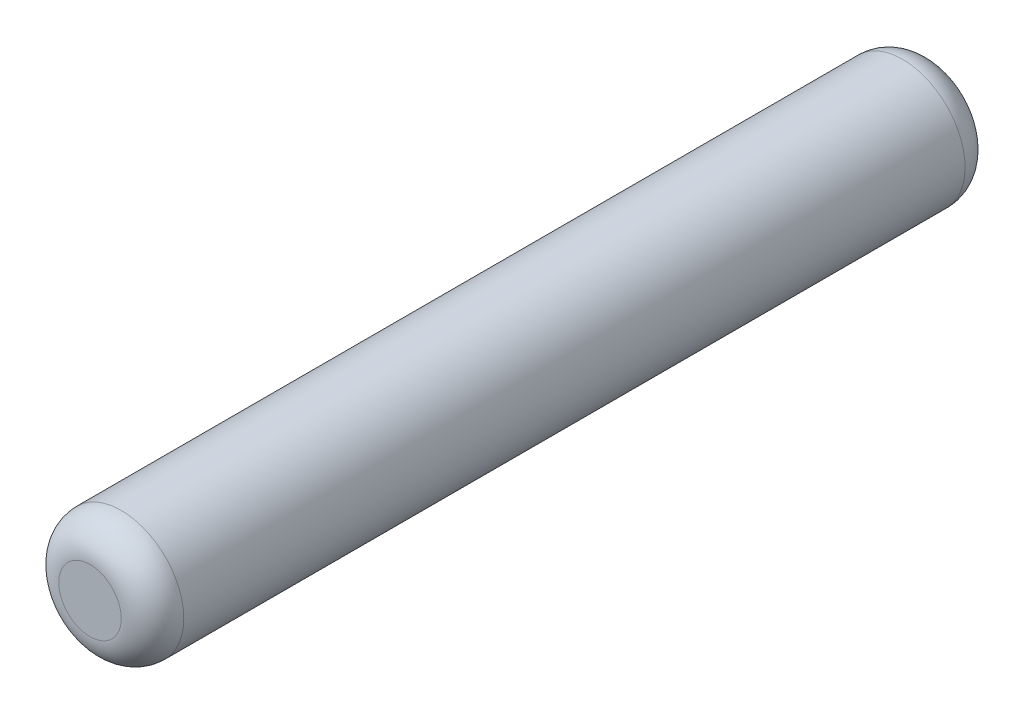
ISO-10303-21;
HEADER;
FILE_DESCRIPTION(('STEP AP214'),'2;1');
FILE_NAME('part.step','',(''),(''),'','','');
FILE_SCHEMA(('AUTOMOTIVE_DESIGN { 1 0 10303 214 1 1 1 1 }'));
ENDSEC;
DATA;
#1=APPLICATION_CONTEXT('core data for automotive mechanical design processes');
#2=APPLICATION_PROTOCOL_DEFINITION('international standard','automotive_design',2000,#1);
#3=PRODUCT_CONTEXT('',#1,'mechanical');
#4=PRODUCT('Part','Part','',(#3));
#5=PRODUCT_RELATED_PRODUCT_CATEGORY('part','',(#4));
#6=PRODUCT_DEFINITION_FORMATION('','',#4);
#7=PRODUCT_DEFINITION_CONTEXT('part definition',#1,'design');
#8=PRODUCT_DEFINITION('design','',#6,#7);
#9=PRODUCT_DEFINITION_SHAPE('','',#8);
#10=(LENGTH_UNIT() NAMED_UNIT(*) SI_UNIT(.MILLI.,.METRE.));
#11=(NAMED_UNIT(*) PLANE_ANGLE_UNIT() SI_UNIT($,.RADIAN.));
#12=(NAMED_UNIT(*) SI_UNIT($,.STERADIAN.) SOLID_ANGLE_UNIT());
#13=UNCERTAINTY_MEASURE_WITH_UNIT(LENGTH_MEASURE(1.E-05),#10,'distance_accuracy_value','');
#14=(GEOMETRIC_REPRESENTATION_CONTEXT(3) GLOBAL_UNCERTAINTY_ASSIGNED_CONTEXT((#13)) GLOBAL_UNIT_ASSIGNED_CONTEXT((#10,
#11,#12)) REPRESENTATION_CONTEXT('',''));
#15=CARTESIAN_POINT('',(0.,0.,0.));
#16=DIRECTION('',(0.,0.,1.));
#17=DIRECTION('',(1.,0.,0.));
#18=AXIS2_PLACEMENT_3D('',#15,#16,#17);
#19=CARTESIAN_POINT('',(0.,0.,27.));
#20=DIRECTION('',(0.,0.,-1.));
#21=DIRECTION('',(-1.,0.,0.));
#22=AXIS2_PLACEMENT_3D('',#19,#20,#21);
#23=CYLINDRICAL_SURFACE('',#22,2.);
#24=CARTESIAN_POINT('',(0.,0.,26.));
#25=DIRECTION('',(0.,0.,1.));
#26=DIRECTION('',(1.,0.,0.));
#27=AXIS2_PLACEMENT_3D('',#24,#25,#26);
#28=CIRCLE('',#27,2.);
#29=CARTESIAN_POINT('',(2.,0.,26.));
#30=VERTEX_POINT('',#29);
#31=EDGE_CURVE('E36',#30,#30,#28,.F.);
#32=ORIENTED_EDGE('',*,*,#31,.T.);
#33=EDGE_LOOP('',(#32));
#34=FACE_BOUND('',#33,.T.);
#35=CARTESIAN_POINT('',(0.,0.,1.));
#36=DIRECTION('',(0.,0.,1.));
#37=DIRECTION('',(1.,0.,0.));
#38=AXIS2_PLACEMENT_3D('',#35,#36,#37);
#39=CIRCLE('',#38,2.);
#40=CARTESIAN_POINT('',(2.,0.,1.));
#41=VERTEX_POINT('',#40);
#42=EDGE_CURVE('E40',#41,#41,#39,.T.);
#43=ORIENTED_EDGE('',*,*,#42,.T.);
#44=EDGE_LOOP('',(#43));
#45=FACE_BOUND('',#44,.T.);
#46=ADVANCED_FACE('F30',(#34,#45),#23,.T.);
#47=CARTESIAN_POINT('',(0.,0.,27.));
#48=DIRECTION('',(0.,0.,1.));
#49=DIRECTION('',(1.,0.,0.));
#50=AXIS2_PLACEMENT_3D('',#47,#48,#49);
#51=PLANE('',#50);
#52=CARTESIAN_POINT('',(0.,0.,27.));
#53=DIRECTION('',(0.,0.,1.));
#54=DIRECTION('',(1.,0.,0.));
#55=AXIS2_PLACEMENT_3D('',#52,#53,#54);
#56=CIRCLE('',#55,0.999999999999998);
#57=CARTESIAN_POINT('',(0.999999999999998,0.,27.));
#58=VERTEX_POINT('',#57);
#59=EDGE_CURVE('E44',#58,#58,#56,.T.);
#60=ORIENTED_EDGE('',*,*,#59,.T.);
#61=EDGE_LOOP('',(#60));
#62=FACE_BOUND('',#61,.T.);
#63=ADVANCED_FACE('F50',(#62),#51,.T.);
#64=CARTESIAN_POINT('',(0.,0.,0.));
#65=DIRECTION('',(0.,0.,1.));
#66=DIRECTION('',(1.,0.,0.));
#67=AXIS2_PLACEMENT_3D('',#64,#65,#66);
#68=PLANE('',#67);
#69=CARTESIAN_POINT('',(0.,0.,0.));
#70=DIRECTION('',(0.,0.,1.));
#71=DIRECTION('',(1.,0.,0.));
#72=AXIS2_PLACEMENT_3D('',#69,#70,#71);
#73=CIRCLE('',#72,0.999999999999998);
#74=CARTESIAN_POINT('',(0.999999999999998,0.,0.));
#75=VERTEX_POINT('',#74);
#76=EDGE_CURVE('E10',#75,#75,#73,.F.);
#77=ORIENTED_EDGE('',*,*,#76,.T.);
#78=EDGE_LOOP('',(#77));
#79=FACE_BOUND('',#78,.T.);
#80=ADVANCED_FACE('F55',(#79),#68,.F.);
#81=CARTESIAN_POINT('',(0.,0.,26.));
#82=DIRECTION('',(0.,0.,1.));
#83=DIRECTION('',(1.,0.,0.));
#84=AXIS2_PLACEMENT_3D('',#81,#82,#83);
#85=DEGENERATE_TOROIDAL_SURFACE('',#84,0.999999999999998,1.,.T.);
#86=ORIENTED_EDGE('',*,*,#31,.F.);
#87=EDGE_LOOP('',(#86));
#88=FACE_BOUND('',#87,.T.);
#89=ORIENTED_EDGE('',*,*,#59,.F.);
#90=EDGE_LOOP('',(#89));
#91=FACE_BOUND('',#90,.T.);
#92=ADVANCED_FACE('F52',(#88,#91),#85,.T.);
#93=CARTESIAN_POINT('',(0.,0.,1.));
#94=DIRECTION('',(0.,0.,1.));
#95=DIRECTION('',(1.,0.,0.));
#96=AXIS2_PLACEMENT_3D('',#93,#94,#95);
#97=DEGENERATE_TOROIDAL_SURFACE('',#96,0.999999999999998,1.,.T.);
#98=ORIENTED_EDGE('',*,*,#76,.F.);
#99=EDGE_LOOP('',(#98));
#100=FACE_BOUND('',#99,.T.);
#101=ORIENTED_EDGE('',*,*,#42,.F.);
#102=EDGE_LOOP('',(#101));
#103=FACE_BOUND('',#102,.T.);
#104=ADVANCED_FACE('F54',(#100,#103),#97,.T.);
#105=CLOSED_SHELL('',(#46,#63,#80,#92,#104));
#106=MANIFOLD_SOLID_BREP('B2',#105);
#107=ADVANCED_BREP_SHAPE_REPRESENTATION('',(#18,#106),#14);
#108=SHAPE_DEFINITION_REPRESENTATION(#9,#107);
ENDSEC;
END-ISO-10303-21;
